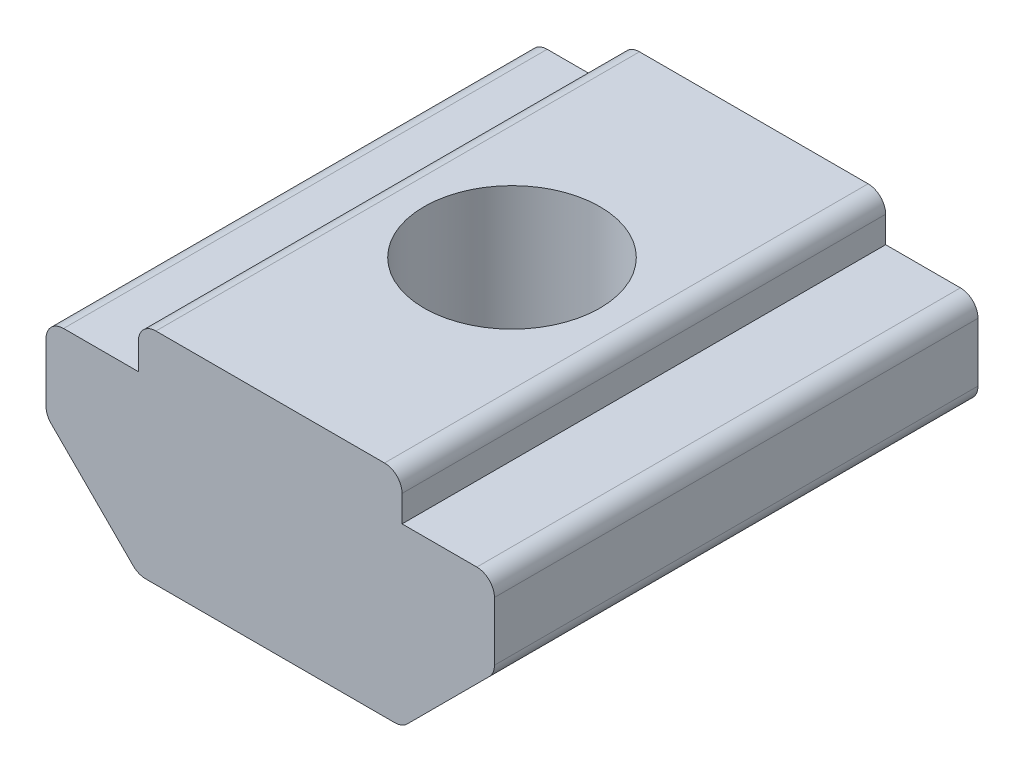
ISO-10303-21;
HEADER;
FILE_DESCRIPTION(('STEP AP214'),'2;1');
FILE_NAME('part.step','',(''),(''),'','','');
FILE_SCHEMA(('AUTOMOTIVE_DESIGN { 1 0 10303 214 1 1 1 1 }'));
ENDSEC;
DATA;
#1=APPLICATION_CONTEXT('core data for automotive mechanical design processes');
#2=APPLICATION_PROTOCOL_DEFINITION('international standard','automotive_design',2000,#1);
#3=PRODUCT_CONTEXT('',#1,'mechanical');
#4=PRODUCT('Part','Part','',(#3));
#5=PRODUCT_RELATED_PRODUCT_CATEGORY('part','',(#4));
#6=PRODUCT_DEFINITION_FORMATION('','',#4);
#7=PRODUCT_DEFINITION_CONTEXT('part definition',#1,'design');
#8=PRODUCT_DEFINITION('design','',#6,#7);
#9=PRODUCT_DEFINITION_SHAPE('','',#8);
#10=(LENGTH_UNIT() NAMED_UNIT(*) SI_UNIT(.MILLI.,.METRE.));
#11=(NAMED_UNIT(*) PLANE_ANGLE_UNIT() SI_UNIT($,.RADIAN.));
#12=(NAMED_UNIT(*) SI_UNIT($,.STERADIAN.) SOLID_ANGLE_UNIT());
#13=UNCERTAINTY_MEASURE_WITH_UNIT(LENGTH_MEASURE(1.E-05),#10,'distance_accuracy_value','');
#14=(GEOMETRIC_REPRESENTATION_CONTEXT(3) GLOBAL_UNCERTAINTY_ASSIGNED_CONTEXT((#13)) GLOBAL_UNIT_ASSIGNED_CONTEXT((#10,
#11,#12)) REPRESENTATION_CONTEXT('',''));
#15=CARTESIAN_POINT('',(0.,0.,0.));
#16=DIRECTION('',(0.,0.,1.));
#17=DIRECTION('',(1.,0.,0.));
#18=AXIS2_PLACEMENT_3D('',#15,#16,#17);
#19=CARTESIAN_POINT('',(-5.1,-1.9,5.5));
#20=DIRECTION('',(1.,0.,0.));
#21=DIRECTION('',(0.,1.,0.));
#22=AXIS2_PLACEMENT_3D('',#19,#20,#21);
#23=PLANE('',#22);
#24=DIRECTION('',(0.,-1.,0.));
#25=VECTOR('',#24,1.);
#26=CARTESIAN_POINT('',(-5.1,-1.9,5.5));
#27=LINE('',#26,#25);
#28=CARTESIAN_POINT('',(-5.1,-0.4,5.5));
#29=VERTEX_POINT('',#28);
#30=CARTESIAN_POINT('',(-5.1,-1.73431457505077,5.5));
#31=VERTEX_POINT('',#30);
#32=EDGE_CURVE('E226',#29,#31,#27,.T.);
#33=ORIENTED_EDGE('',*,*,#32,.F.);
#34=DIRECTION('',(0.,0.,-1.));
#35=VECTOR('',#34,1.);
#36=CARTESIAN_POINT('',(-5.1,-0.4,5.5));
#37=LINE('',#36,#35);
#38=CARTESIAN_POINT('',(-5.1,-0.4,-5.5));
#39=VERTEX_POINT('',#38);
#40=EDGE_CURVE('E269',#29,#39,#37,.T.);
#41=ORIENTED_EDGE('',*,*,#40,.T.);
#42=DIRECTION('',(0.,-1.,0.));
#43=VECTOR('',#42,1.);
#44=CARTESIAN_POINT('',(-5.1,-1.9,-5.5));
#45=LINE('',#44,#43);
#46=CARTESIAN_POINT('',(-5.1,-1.73431457505077,-5.5));
#47=VERTEX_POINT('',#46);
#48=EDGE_CURVE('E200',#39,#47,#45,.T.);
#49=ORIENTED_EDGE('',*,*,#48,.T.);
#50=DIRECTION('',(0.,0.,-1.));
#51=VECTOR('',#50,1.);
#52=CARTESIAN_POINT('',(-5.1,-1.73431457505077,5.5));
#53=LINE('',#52,#51);
#54=EDGE_CURVE('E267',#47,#31,#53,.F.);
#55=ORIENTED_EDGE('',*,*,#54,.T.);
#56=EDGE_LOOP('',(#33,#41,#49,#55));
#57=FACE_BOUND('',#56,.T.);
#58=ADVANCED_FACE('F37',(#57),#23,.F.);
#59=CARTESIAN_POINT('',(-3.,-4.,5.5));
#60=DIRECTION('',(0.707106781186547,0.707106781186548,0.));
#61=DIRECTION('',(-0.707106781186548,0.707106781186547,0.));
#62=AXIS2_PLACEMENT_3D('',#59,#60,#61);
#63=PLANE('',#62);
#64=DIRECTION('',(0.707106781186548,-0.707106781186547,0.));
#65=VECTOR('',#64,1.);
#66=CARTESIAN_POINT('',(-3.,-4.,5.5));
#67=LINE('',#66,#65);
#68=CARTESIAN_POINT('',(-4.98284271247462,-2.01715728752538,5.5));
#69=VERTEX_POINT('',#68);
#70=CARTESIAN_POINT('',(-3.11715728752538,-3.88284271247462,5.5));
#71=VERTEX_POINT('',#70);
#72=EDGE_CURVE('E310',#69,#71,#67,.T.);
#73=ORIENTED_EDGE('',*,*,#72,.F.);
#74=DIRECTION('',(0.,0.,-1.));
#75=VECTOR('',#74,1.);
#76=CARTESIAN_POINT('',(-4.98284271247462,-2.01715728752538,5.5));
#77=LINE('',#76,#75);
#78=CARTESIAN_POINT('',(-4.98284271247462,-2.01715728752538,-5.5));
#79=VERTEX_POINT('',#78);
#80=EDGE_CURVE('E275',#69,#79,#77,.T.);
#81=ORIENTED_EDGE('',*,*,#80,.T.);
#82=DIRECTION('',(0.707106781186548,-0.707106781186547,0.));
#83=VECTOR('',#82,1.);
#84=CARTESIAN_POINT('',(-3.,-4.,-5.5));
#85=LINE('',#84,#83);
#86=CARTESIAN_POINT('',(-3.11715728752538,-3.88284271247462,-5.5));
#87=VERTEX_POINT('',#86);
#88=EDGE_CURVE('E203',#79,#87,#85,.T.);
#89=ORIENTED_EDGE('',*,*,#88,.T.);
#90=DIRECTION('',(0.,0.,-1.));
#91=VECTOR('',#90,1.);
#92=CARTESIAN_POINT('',(-3.11715728752538,-3.88284271247462,5.5));
#93=LINE('',#92,#91);
#94=EDGE_CURVE('E273',#87,#71,#93,.F.);
#95=ORIENTED_EDGE('',*,*,#94,.T.);
#96=EDGE_LOOP('',(#73,#81,#89,#95));
#97=FACE_BOUND('',#96,.T.);
#98=ADVANCED_FACE('F363',(#97),#63,.F.);
#99=CARTESIAN_POINT('',(3.,-4.,5.5));
#100=DIRECTION('',(0.,1.,0.));
#101=DIRECTION('',(0.,0.,1.));
#102=AXIS2_PLACEMENT_3D('',#99,#100,#101);
#103=PLANE('',#102);
#104=CARTESIAN_POINT('',(0.,-4.,0.));
#105=DIRECTION('',(0.,1.,0.));
#106=DIRECTION('',(0.,0.,1.));
#107=AXIS2_PLACEMENT_3D('',#104,#105,#106);
#108=CIRCLE('',#107,2.);
#109=CARTESIAN_POINT('',(0.,-4.,2.));
#110=VERTEX_POINT('',#109);
#111=EDGE_CURVE('E204',#110,#110,#108,.T.);
#112=ORIENTED_EDGE('',*,*,#111,.T.);
#113=EDGE_LOOP('',(#112));
#114=FACE_BOUND('',#113,.T.);
#115=DIRECTION('',(1.,0.,0.));
#116=VECTOR('',#115,1.);
#117=CARTESIAN_POINT('',(3.,-4.,5.5));
#118=LINE('',#117,#116);
#119=CARTESIAN_POINT('',(-2.83431457505076,-4.,5.5));
#120=VERTEX_POINT('',#119);
#121=CARTESIAN_POINT('',(2.83431457505076,-4.,5.5));
#122=VERTEX_POINT('',#121);
#123=EDGE_CURVE('E305',#120,#122,#118,.T.);
#124=ORIENTED_EDGE('',*,*,#123,.F.);
#125=DIRECTION('',(0.,0.,-1.));
#126=VECTOR('',#125,1.);
#127=CARTESIAN_POINT('',(-2.83431457505076,-4.,5.5));
#128=LINE('',#127,#126);
#129=CARTESIAN_POINT('',(-2.83431457505076,-4.,-5.5));
#130=VERTEX_POINT('',#129);
#131=EDGE_CURVE('E280',#120,#130,#128,.T.);
#132=ORIENTED_EDGE('',*,*,#131,.T.);
#133=DIRECTION('',(1.,0.,0.));
#134=VECTOR('',#133,1.);
#135=CARTESIAN_POINT('',(3.,-4.,-5.5));
#136=LINE('',#135,#134);
#137=CARTESIAN_POINT('',(2.83431457505076,-4.,-5.5));
#138=VERTEX_POINT('',#137);
#139=EDGE_CURVE('E207',#130,#138,#136,.T.);
#140=ORIENTED_EDGE('',*,*,#139,.T.);
#141=DIRECTION('',(0.,0.,-1.));
#142=VECTOR('',#141,1.);
#143=CARTESIAN_POINT('',(2.83431457505076,-4.,5.5));
#144=LINE('',#143,#142);
#145=EDGE_CURVE('E278',#138,#122,#144,.F.);
#146=ORIENTED_EDGE('',*,*,#145,.T.);
#147=EDGE_LOOP('',(#124,#132,#140,#146));
#148=FACE_BOUND('',#147,.T.);
#149=ADVANCED_FACE('F321',(#114,#148),#103,.F.);
#150=CARTESIAN_POINT('',(5.1,-1.9,5.5));
#151=DIRECTION('',(-0.707106781186547,0.707106781186548,0.));
#152=DIRECTION('',(-0.707106781186548,-0.707106781186547,0.));
#153=AXIS2_PLACEMENT_3D('',#150,#151,#152);
#154=PLANE('',#153);
#155=DIRECTION('',(0.707106781186548,0.707106781186547,0.));
#156=VECTOR('',#155,1.);
#157=CARTESIAN_POINT('',(5.1,-1.9,5.5));
#158=LINE('',#157,#156);
#159=CARTESIAN_POINT('',(3.11715728752538,-3.88284271247462,5.5));
#160=VERTEX_POINT('',#159);
#161=CARTESIAN_POINT('',(4.98284271247462,-2.01715728752538,5.5));
#162=VERTEX_POINT('',#161);
#163=EDGE_CURVE('E304',#160,#162,#158,.T.);
#164=ORIENTED_EDGE('',*,*,#163,.F.);
#165=DIRECTION('',(0.,0.,-1.));
#166=VECTOR('',#165,1.);
#167=CARTESIAN_POINT('',(3.11715728752538,-3.88284271247462,5.5));
#168=LINE('',#167,#166);
#169=CARTESIAN_POINT('',(3.11715728752538,-3.88284271247462,-5.5));
#170=VERTEX_POINT('',#169);
#171=EDGE_CURVE('E285',#160,#170,#168,.T.);
#172=ORIENTED_EDGE('',*,*,#171,.T.);
#173=DIRECTION('',(0.707106781186548,0.707106781186547,0.));
#174=VECTOR('',#173,1.);
#175=CARTESIAN_POINT('',(5.1,-1.9,-5.5));
#176=LINE('',#175,#174);
#177=CARTESIAN_POINT('',(4.98284271247462,-2.01715728752538,-5.5));
#178=VERTEX_POINT('',#177);
#179=EDGE_CURVE('E210',#170,#178,#176,.T.);
#180=ORIENTED_EDGE('',*,*,#179,.T.);
#181=DIRECTION('',(0.,0.,-1.));
#182=VECTOR('',#181,1.);
#183=CARTESIAN_POINT('',(4.98284271247462,-2.01715728752538,5.5));
#184=LINE('',#183,#182);
#185=EDGE_CURVE('E283',#178,#162,#184,.F.);
#186=ORIENTED_EDGE('',*,*,#185,.T.);
#187=EDGE_LOOP('',(#164,#172,#180,#186));
#188=FACE_BOUND('',#187,.T.);
#189=ADVANCED_FACE('F378',(#188),#154,.F.);
#190=CARTESIAN_POINT('',(5.1,0.,5.5));
#191=DIRECTION('',(-1.,0.,0.));
#192=DIRECTION('',(0.,-1.,0.));
#193=AXIS2_PLACEMENT_3D('',#190,#191,#192);
#194=PLANE('',#193);
#195=DIRECTION('',(0.,1.,0.));
#196=VECTOR('',#195,1.);
#197=CARTESIAN_POINT('',(5.1,0.,5.5));
#198=LINE('',#197,#196);
#199=CARTESIAN_POINT('',(5.1,-1.73431457505076,5.5));
#200=VERTEX_POINT('',#199);
#201=CARTESIAN_POINT('',(5.1,-0.4,5.5));
#202=VERTEX_POINT('',#201);
#203=EDGE_CURVE('E175',#200,#202,#198,.T.);
#204=ORIENTED_EDGE('',*,*,#203,.F.);
#205=DIRECTION('',(0.,0.,-1.));
#206=VECTOR('',#205,1.);
#207=CARTESIAN_POINT('',(5.1,-1.73431457505076,5.5));
#208=LINE('',#207,#206);
#209=CARTESIAN_POINT('',(5.1,-1.73431457505076,-5.5));
#210=VERTEX_POINT('',#209);
#211=EDGE_CURVE('E45',#200,#210,#208,.T.);
#212=ORIENTED_EDGE('',*,*,#211,.T.);
#213=DIRECTION('',(0.,1.,0.));
#214=VECTOR('',#213,1.);
#215=CARTESIAN_POINT('',(5.1,0.,-5.5));
#216=LINE('',#215,#214);
#217=CARTESIAN_POINT('',(5.1,-0.4,-5.5));
#218=VERTEX_POINT('',#217);
#219=EDGE_CURVE('E213',#210,#218,#216,.T.);
#220=ORIENTED_EDGE('',*,*,#219,.T.);
#221=DIRECTION('',(0.,0.,-1.));
#222=VECTOR('',#221,1.);
#223=CARTESIAN_POINT('',(5.1,-0.4,5.5));
#224=LINE('',#223,#222);
#225=EDGE_CURVE('E288',#218,#202,#224,.F.);
#226=ORIENTED_EDGE('',*,*,#225,.T.);
#227=EDGE_LOOP('',(#204,#212,#220,#226));
#228=FACE_BOUND('',#227,.T.);
#229=ADVANCED_FACE('F294',(#228),#194,.F.);
#230=CARTESIAN_POINT('',(3.,0.,5.5));
#231=DIRECTION('',(0.,-1.,0.));
#232=DIRECTION('',(0.,0.,-1.));
#233=AXIS2_PLACEMENT_3D('',#230,#231,#232);
#234=PLANE('',#233);
#235=DIRECTION('',(-1.,0.,0.));
#236=VECTOR('',#235,1.);
#237=CARTESIAN_POINT('',(3.,0.,5.5));
#238=LINE('',#237,#236);
#239=CARTESIAN_POINT('',(4.7,0.,5.5));
#240=VERTEX_POINT('',#239);
#241=CARTESIAN_POINT('',(3.,0.,5.5));
#242=VERTEX_POINT('',#241);
#243=EDGE_CURVE('E164',#240,#242,#238,.T.);
#244=ORIENTED_EDGE('',*,*,#243,.F.);
#245=DIRECTION('',(0.,0.,-1.));
#246=VECTOR('',#245,1.);
#247=CARTESIAN_POINT('',(4.7,0.,5.5));
#248=LINE('',#247,#246);
#249=CARTESIAN_POINT('',(4.7,0.,-5.5));
#250=VERTEX_POINT('',#249);
#251=EDGE_CURVE('E11',#240,#250,#248,.T.);
#252=ORIENTED_EDGE('',*,*,#251,.T.);
#253=DIRECTION('',(-1.,0.,0.));
#254=VECTOR('',#253,1.);
#255=CARTESIAN_POINT('',(3.,0.,-5.5));
#256=LINE('',#255,#254);
#257=CARTESIAN_POINT('',(3.,0.,-5.5));
#258=VERTEX_POINT('',#257);
#259=EDGE_CURVE('E181',#250,#258,#256,.T.);
#260=ORIENTED_EDGE('',*,*,#259,.T.);
#261=DIRECTION('',(0.,0.,-1.));
#262=VECTOR('',#261,1.);
#263=CARTESIAN_POINT('',(3.,0.,5.5));
#264=LINE('',#263,#262);
#265=EDGE_CURVE('E178',#242,#258,#264,.T.);
#266=ORIENTED_EDGE('',*,*,#265,.F.);
#267=EDGE_LOOP('',(#244,#252,#260,#266));
#268=FACE_BOUND('',#267,.T.);
#269=ADVANCED_FACE('F179',(#268),#234,.F.);
#270=CARTESIAN_POINT('',(3.,0.999999999999999,5.5));
#271=DIRECTION('',(-1.,0.,0.));
#272=DIRECTION('',(0.,0.,1.));
#273=AXIS2_PLACEMENT_3D('',#270,#271,#272);
#274=PLANE('',#273);
#275=DIRECTION('',(0.,1.,0.));
#276=VECTOR('',#275,1.);
#277=CARTESIAN_POINT('',(3.,0.999999999999999,-5.5));
#278=LINE('',#277,#276);
#279=CARTESIAN_POINT('',(3.,0.599999999999999,-5.5));
#280=VERTEX_POINT('',#279);
#281=EDGE_CURVE('E217',#258,#280,#278,.T.);
#282=ORIENTED_EDGE('',*,*,#281,.T.);
#283=DIRECTION('',(0.,0.,-1.));
#284=VECTOR('',#283,1.);
#285=CARTESIAN_POINT('',(3.,0.599999999999999,5.5));
#286=LINE('',#285,#284);
#287=CARTESIAN_POINT('',(3.,0.599999999999999,5.5));
#288=VERTEX_POINT('',#287);
#289=EDGE_CURVE('E190',#280,#288,#286,.F.);
#290=ORIENTED_EDGE('',*,*,#289,.T.);
#291=DIRECTION('',(0.,1.,0.));
#292=VECTOR('',#291,1.);
#293=CARTESIAN_POINT('',(3.,0.999999999999999,5.5));
#294=LINE('',#293,#292);
#295=EDGE_CURVE('E168',#242,#288,#294,.T.);
#296=ORIENTED_EDGE('',*,*,#295,.F.);
#297=ORIENTED_EDGE('',*,*,#265,.T.);
#298=EDGE_LOOP('',(#282,#290,#296,#297));
#299=FACE_BOUND('',#298,.T.);
#300=ADVANCED_FACE('F188',(#299),#274,.F.);
#301=CARTESIAN_POINT('',(-3.,0.999999999999999,5.5));
#302=DIRECTION('',(0.,-1.,0.));
#303=DIRECTION('',(0.,0.,-1.));
#304=AXIS2_PLACEMENT_3D('',#301,#302,#303);
#305=PLANE('',#304);
#306=CARTESIAN_POINT('',(0.,0.999999999999999,0.));
#307=DIRECTION('',(0.,1.,0.));
#308=DIRECTION('',(0.,0.,1.));
#309=AXIS2_PLACEMENT_3D('',#306,#307,#308);
#310=CIRCLE('',#309,2.);
#311=CARTESIAN_POINT('',(0.,0.999999999999999,2.));
#312=VERTEX_POINT('',#311);
#313=EDGE_CURVE('E315',#312,#312,#310,.T.);
#314=ORIENTED_EDGE('',*,*,#313,.F.);
#315=EDGE_LOOP('',(#314));
#316=FACE_BOUND('',#315,.T.);
#317=DIRECTION('',(-1.,0.,0.));
#318=VECTOR('',#317,1.);
#319=CARTESIAN_POINT('',(-3.,0.999999999999999,5.5));
#320=LINE('',#319,#318);
#321=CARTESIAN_POINT('',(2.6,0.999999999999999,5.5));
#322=VERTEX_POINT('',#321);
#323=CARTESIAN_POINT('',(-2.6,0.999999999999999,5.5));
#324=VERTEX_POINT('',#323);
#325=EDGE_CURVE('E191',#322,#324,#320,.T.);
#326=ORIENTED_EDGE('',*,*,#325,.F.);
#327=DIRECTION('',(0.,0.,-1.));
#328=VECTOR('',#327,1.);
#329=CARTESIAN_POINT('',(2.6,0.999999999999999,5.5));
#330=LINE('',#329,#328);
#331=CARTESIAN_POINT('',(2.6,0.999999999999999,-5.5));
#332=VERTEX_POINT('',#331);
#333=EDGE_CURVE('E230',#322,#332,#330,.T.);
#334=ORIENTED_EDGE('',*,*,#333,.T.);
#335=DIRECTION('',(-1.,0.,0.));
#336=VECTOR('',#335,1.);
#337=CARTESIAN_POINT('',(-3.,0.999999999999999,-5.5));
#338=LINE('',#337,#336);
#339=CARTESIAN_POINT('',(-2.6,0.999999999999999,-5.5));
#340=VERTEX_POINT('',#339);
#341=EDGE_CURVE('E219',#332,#340,#338,.T.);
#342=ORIENTED_EDGE('',*,*,#341,.T.);
#343=DIRECTION('',(0.,0.,-1.));
#344=VECTOR('',#343,1.);
#345=CARTESIAN_POINT('',(-2.6,0.999999999999999,5.5));
#346=LINE('',#345,#344);
#347=EDGE_CURVE('E185',#340,#324,#346,.F.);
#348=ORIENTED_EDGE('',*,*,#347,.T.);
#349=EDGE_LOOP('',(#326,#334,#342,#348));
#350=FACE_BOUND('',#349,.T.);
#351=ADVANCED_FACE('F331',(#316,#350),#305,.F.);
#352=CARTESIAN_POINT('',(-3.,0.,5.5));
#353=DIRECTION('',(1.,0.,0.));
#354=DIRECTION('',(0.,0.,-1.));
#355=AXIS2_PLACEMENT_3D('',#352,#353,#354);
#356=PLANE('',#355);
#357=DIRECTION('',(0.,-1.,0.));
#358=VECTOR('',#357,1.);
#359=CARTESIAN_POINT('',(-3.,0.,5.5));
#360=LINE('',#359,#358);
#361=CARTESIAN_POINT('',(-3.,0.599999999999999,5.5));
#362=VERTEX_POINT('',#361);
#363=CARTESIAN_POINT('',(-3.,0.,5.5));
#364=VERTEX_POINT('',#363);
#365=EDGE_CURVE('E193',#362,#364,#360,.T.);
#366=ORIENTED_EDGE('',*,*,#365,.F.);
#367=DIRECTION('',(0.,0.,-1.));
#368=VECTOR('',#367,1.);
#369=CARTESIAN_POINT('',(-3.,0.599999999999999,5.5));
#370=LINE('',#369,#368);
#371=CARTESIAN_POINT('',(-3.,0.599999999999999,-5.5));
#372=VERTEX_POINT('',#371);
#373=EDGE_CURVE('E264',#362,#372,#370,.T.);
#374=ORIENTED_EDGE('',*,*,#373,.T.);
#375=DIRECTION('',(0.,-1.,0.));
#376=VECTOR('',#375,1.);
#377=CARTESIAN_POINT('',(-3.,0.,-5.5));
#378=LINE('',#377,#376);
#379=CARTESIAN_POINT('',(-3.,0.,-5.5));
#380=VERTEX_POINT('',#379);
#381=EDGE_CURVE('E222',#372,#380,#378,.T.);
#382=ORIENTED_EDGE('',*,*,#381,.T.);
#383=DIRECTION('',(0.,0.,-1.));
#384=VECTOR('',#383,1.);
#385=CARTESIAN_POINT('',(-3.,0.,5.5));
#386=LINE('',#385,#384);
#387=EDGE_CURVE('E186',#364,#380,#386,.T.);
#388=ORIENTED_EDGE('',*,*,#387,.F.);
#389=EDGE_LOOP('',(#366,#374,#382,#388));
#390=FACE_BOUND('',#389,.T.);
#391=ADVANCED_FACE('F334',(#390),#356,.F.);
#392=CARTESIAN_POINT('',(-5.1,0.,5.5));
#393=DIRECTION('',(0.,-1.,0.));
#394=DIRECTION('',(0.,0.,-1.));
#395=AXIS2_PLACEMENT_3D('',#392,#393,#394);
#396=PLANE('',#395);
#397=DIRECTION('',(-1.,0.,0.));
#398=VECTOR('',#397,1.);
#399=CARTESIAN_POINT('',(-5.1,0.,-5.5));
#400=LINE('',#399,#398);
#401=CARTESIAN_POINT('',(-4.7,0.,-5.5));
#402=VERTEX_POINT('',#401);
#403=EDGE_CURVE('E224',#380,#402,#400,.T.);
#404=ORIENTED_EDGE('',*,*,#403,.T.);
#405=DIRECTION('',(0.,0.,-1.));
#406=VECTOR('',#405,1.);
#407=CARTESIAN_POINT('',(-4.7,0.,5.5));
#408=LINE('',#407,#406);
#409=CARTESIAN_POINT('',(-4.7,0.,5.5));
#410=VERTEX_POINT('',#409);
#411=EDGE_CURVE('E52',#402,#410,#408,.F.);
#412=ORIENTED_EDGE('',*,*,#411,.T.);
#413=DIRECTION('',(-1.,0.,0.));
#414=VECTOR('',#413,1.);
#415=CARTESIAN_POINT('',(-5.1,0.,5.5));
#416=LINE('',#415,#414);
#417=EDGE_CURVE('E198',#364,#410,#416,.T.);
#418=ORIENTED_EDGE('',*,*,#417,.F.);
#419=ORIENTED_EDGE('',*,*,#387,.T.);
#420=EDGE_LOOP('',(#404,#412,#418,#419));
#421=FACE_BOUND('',#420,.T.);
#422=ADVANCED_FACE('F348',(#421),#396,.F.);
#423=CARTESIAN_POINT('',(0.,0.,5.5));
#424=DIRECTION('',(0.,0.,-1.));
#425=DIRECTION('',(-1.,0.,0.));
#426=AXIS2_PLACEMENT_3D('',#423,#424,#425);
#427=PLANE('',#426);
#428=ORIENTED_EDGE('',*,*,#295,.T.);
#429=CARTESIAN_POINT('',(2.6,0.599999999999999,5.5));
#430=DIRECTION('',(0.,0.,-1.));
#431=DIRECTION('',(-1.,0.,0.));
#432=AXIS2_PLACEMENT_3D('',#429,#430,#431);
#433=CIRCLE('',#432,0.4);
#434=EDGE_CURVE('E262',#288,#322,#433,.F.);
#435=ORIENTED_EDGE('',*,*,#434,.T.);
#436=ORIENTED_EDGE('',*,*,#325,.T.);
#437=CARTESIAN_POINT('',(-2.6,0.599999999999999,5.5));
#438=DIRECTION('',(0.,0.,-1.));
#439=DIRECTION('',(-1.,0.,0.));
#440=AXIS2_PLACEMENT_3D('',#437,#438,#439);
#441=CIRCLE('',#440,0.4);
#442=EDGE_CURVE('E60',#324,#362,#441,.F.);
#443=ORIENTED_EDGE('',*,*,#442,.T.);
#444=ORIENTED_EDGE('',*,*,#365,.T.);
#445=ORIENTED_EDGE('',*,*,#417,.T.);
#446=CARTESIAN_POINT('',(-4.7,-0.4,5.5));
#447=DIRECTION('',(0.,0.,-1.));
#448=DIRECTION('',(-1.,0.,0.));
#449=AXIS2_PLACEMENT_3D('',#446,#447,#448);
#450=CIRCLE('',#449,0.4);
#451=EDGE_CURVE('E259',#410,#29,#450,.F.);
#452=ORIENTED_EDGE('',*,*,#451,.T.);
#453=ORIENTED_EDGE('',*,*,#32,.T.);
#454=CARTESIAN_POINT('',(-4.7,-1.73431457505077,5.5));
#455=DIRECTION('',(0.,0.,-1.));
#456=DIRECTION('',(-1.,0.,0.));
#457=AXIS2_PLACEMENT_3D('',#454,#455,#456);
#458=CIRCLE('',#457,0.4);
#459=EDGE_CURVE('E257',#31,#69,#458,.F.);
#460=ORIENTED_EDGE('',*,*,#459,.T.);
#461=ORIENTED_EDGE('',*,*,#72,.T.);
#462=CARTESIAN_POINT('',(-2.83431457505076,-3.6,5.5));
#463=DIRECTION('',(0.,0.,-1.));
#464=DIRECTION('',(-1.,0.,0.));
#465=AXIS2_PLACEMENT_3D('',#462,#463,#464);
#466=CIRCLE('',#465,0.4);
#467=EDGE_CURVE('E255',#71,#120,#466,.F.);
#468=ORIENTED_EDGE('',*,*,#467,.T.);
#469=ORIENTED_EDGE('',*,*,#123,.T.);
#470=CARTESIAN_POINT('',(2.83431457505076,-3.6,5.5));
#471=DIRECTION('',(0.,0.,-1.));
#472=DIRECTION('',(-1.,0.,0.));
#473=AXIS2_PLACEMENT_3D('',#470,#471,#472);
#474=CIRCLE('',#473,0.4);
#475=EDGE_CURVE('E253',#122,#160,#474,.F.);
#476=ORIENTED_EDGE('',*,*,#475,.T.);
#477=ORIENTED_EDGE('',*,*,#163,.T.);
#478=CARTESIAN_POINT('',(4.7,-1.73431457505076,5.5));
#479=DIRECTION('',(0.,0.,-1.));
#480=DIRECTION('',(-1.,0.,0.));
#481=AXIS2_PLACEMENT_3D('',#478,#479,#480);
#482=CIRCLE('',#481,0.4);
#483=EDGE_CURVE('E251',#162,#200,#482,.F.);
#484=ORIENTED_EDGE('',*,*,#483,.T.);
#485=ORIENTED_EDGE('',*,*,#203,.T.);
#486=CARTESIAN_POINT('',(4.7,-0.4,5.5));
#487=DIRECTION('',(0.,0.,-1.));
#488=DIRECTION('',(-1.,0.,0.));
#489=AXIS2_PLACEMENT_3D('',#486,#487,#488);
#490=CIRCLE('',#489,0.4);
#491=EDGE_CURVE('E172',#202,#240,#490,.F.);
#492=ORIENTED_EDGE('',*,*,#491,.T.);
#493=ORIENTED_EDGE('',*,*,#243,.T.);
#494=EDGE_LOOP('',(#428,#435,#436,#443,#444,#445,#452,#453,#460,#461,#468,#469,#476,#477,#484,
#485,#492,#493));
#495=FACE_BOUND('',#494,.T.);
#496=ADVANCED_FACE('F166',(#495),#427,.F.);
#497=CARTESIAN_POINT('',(0.,0.,-5.5));
#498=DIRECTION('',(0.,0.,-1.));
#499=DIRECTION('',(-1.,0.,0.));
#500=AXIS2_PLACEMENT_3D('',#497,#498,#499);
#501=PLANE('',#500);
#502=ORIENTED_EDGE('',*,*,#341,.F.);
#503=CARTESIAN_POINT('',(2.6,0.599999999999999,-5.5));
#504=DIRECTION('',(0.,0.,-1.));
#505=DIRECTION('',(-1.,0.,0.));
#506=AXIS2_PLACEMENT_3D('',#503,#504,#505);
#507=CIRCLE('',#506,0.4);
#508=EDGE_CURVE('E247',#332,#280,#507,.T.);
#509=ORIENTED_EDGE('',*,*,#508,.T.);
#510=ORIENTED_EDGE('',*,*,#281,.F.);
#511=ORIENTED_EDGE('',*,*,#259,.F.);
#512=CARTESIAN_POINT('',(4.7,-0.4,-5.5));
#513=DIRECTION('',(0.,0.,-1.));
#514=DIRECTION('',(-1.,0.,0.));
#515=AXIS2_PLACEMENT_3D('',#512,#513,#514);
#516=CIRCLE('',#515,0.4);
#517=EDGE_CURVE('E233',#250,#218,#516,.T.);
#518=ORIENTED_EDGE('',*,*,#517,.T.);
#519=ORIENTED_EDGE('',*,*,#219,.F.);
#520=CARTESIAN_POINT('',(4.7,-1.73431457505076,-5.5));
#521=DIRECTION('',(0.,0.,-1.));
#522=DIRECTION('',(-1.,0.,0.));
#523=AXIS2_PLACEMENT_3D('',#520,#521,#522);
#524=CIRCLE('',#523,0.4);
#525=EDGE_CURVE('E235',#210,#178,#524,.T.);
#526=ORIENTED_EDGE('',*,*,#525,.T.);
#527=ORIENTED_EDGE('',*,*,#179,.F.);
#528=CARTESIAN_POINT('',(2.83431457505076,-3.6,-5.5));
#529=DIRECTION('',(0.,0.,-1.));
#530=DIRECTION('',(-1.,0.,0.));
#531=AXIS2_PLACEMENT_3D('',#528,#529,#530);
#532=CIRCLE('',#531,0.4);
#533=EDGE_CURVE('E237',#170,#138,#532,.T.);
#534=ORIENTED_EDGE('',*,*,#533,.T.);
#535=ORIENTED_EDGE('',*,*,#139,.F.);
#536=CARTESIAN_POINT('',(-2.83431457505076,-3.6,-5.5));
#537=DIRECTION('',(0.,0.,-1.));
#538=DIRECTION('',(-1.,0.,0.));
#539=AXIS2_PLACEMENT_3D('',#536,#537,#538);
#540=CIRCLE('',#539,0.4);
#541=EDGE_CURVE('E239',#130,#87,#540,.T.);
#542=ORIENTED_EDGE('',*,*,#541,.T.);
#543=ORIENTED_EDGE('',*,*,#88,.F.);
#544=CARTESIAN_POINT('',(-4.7,-1.73431457505077,-5.5));
#545=DIRECTION('',(0.,0.,-1.));
#546=DIRECTION('',(-1.,0.,0.));
#547=AXIS2_PLACEMENT_3D('',#544,#545,#546);
#548=CIRCLE('',#547,0.4);
#549=EDGE_CURVE('E241',#79,#47,#548,.T.);
#550=ORIENTED_EDGE('',*,*,#549,.T.);
#551=ORIENTED_EDGE('',*,*,#48,.F.);
#552=CARTESIAN_POINT('',(-4.7,-0.4,-5.5));
#553=DIRECTION('',(0.,0.,-1.));
#554=DIRECTION('',(-1.,0.,0.));
#555=AXIS2_PLACEMENT_3D('',#552,#553,#554);
#556=CIRCLE('',#555,0.4);
#557=EDGE_CURVE('E243',#39,#402,#556,.T.);
#558=ORIENTED_EDGE('',*,*,#557,.T.);
#559=ORIENTED_EDGE('',*,*,#403,.F.);
#560=ORIENTED_EDGE('',*,*,#381,.F.);
#561=CARTESIAN_POINT('',(-2.6,0.599999999999999,-5.5));
#562=DIRECTION('',(0.,0.,-1.));
#563=DIRECTION('',(-1.,0.,0.));
#564=AXIS2_PLACEMENT_3D('',#561,#562,#563);
#565=CIRCLE('',#564,0.4);
#566=EDGE_CURVE('E245',#372,#340,#565,.T.);
#567=ORIENTED_EDGE('',*,*,#566,.T.);
#568=EDGE_LOOP('',(#502,#509,#510,#511,#518,#519,#526,#527,#534,#535,#542,#543,#550,#551,#558,
#559,#560,#567));
#569=FACE_BOUND('',#568,.T.);
#570=ADVANCED_FACE('F300',(#569),#501,.T.);
#571=CARTESIAN_POINT('',(0.,-4.,0.));
#572=DIRECTION('',(0.,1.,0.));
#573=DIRECTION('',(0.,0.,1.));
#574=AXIS2_PLACEMENT_3D('',#571,#572,#573);
#575=CYLINDRICAL_SURFACE('',#574,2.);
#576=ORIENTED_EDGE('',*,*,#111,.F.);
#577=EDGE_LOOP('',(#576));
#578=FACE_BOUND('',#577,.T.);
#579=ORIENTED_EDGE('',*,*,#313,.T.);
#580=EDGE_LOOP('',(#579));
#581=FACE_BOUND('',#580,.T.);
#582=ADVANCED_FACE('F324',(#578,#581),#575,.F.);
#583=CARTESIAN_POINT('',(2.6,0.599999999999999,5.5));
#584=DIRECTION('',(0.,0.,-1.));
#585=DIRECTION('',(-1.,0.,0.));
#586=AXIS2_PLACEMENT_3D('',#583,#584,#585);
#587=CYLINDRICAL_SURFACE('',#586,0.4);
#588=ORIENTED_EDGE('',*,*,#434,.F.);
#589=ORIENTED_EDGE('',*,*,#289,.F.);
#590=ORIENTED_EDGE('',*,*,#508,.F.);
#591=ORIENTED_EDGE('',*,*,#333,.F.);
#592=EDGE_LOOP('',(#588,#589,#590,#591));
#593=FACE_BOUND('',#592,.T.);
#594=ADVANCED_FACE('F327',(#593),#587,.T.);
#595=CARTESIAN_POINT('',(-2.6,0.599999999999999,5.5));
#596=DIRECTION('',(0.,0.,-1.));
#597=DIRECTION('',(-1.,0.,0.));
#598=AXIS2_PLACEMENT_3D('',#595,#596,#597);
#599=CYLINDRICAL_SURFACE('',#598,0.4);
#600=ORIENTED_EDGE('',*,*,#442,.F.);
#601=ORIENTED_EDGE('',*,*,#347,.F.);
#602=ORIENTED_EDGE('',*,*,#566,.F.);
#603=ORIENTED_EDGE('',*,*,#373,.F.);
#604=EDGE_LOOP('',(#600,#601,#602,#603));
#605=FACE_BOUND('',#604,.T.);
#606=ADVANCED_FACE('F342',(#605),#599,.T.);
#607=CARTESIAN_POINT('',(-4.7,-0.4,5.5));
#608=DIRECTION('',(0.,0.,-1.));
#609=DIRECTION('',(-1.,0.,0.));
#610=AXIS2_PLACEMENT_3D('',#607,#608,#609);
#611=CYLINDRICAL_SURFACE('',#610,0.4);
#612=ORIENTED_EDGE('',*,*,#451,.F.);
#613=ORIENTED_EDGE('',*,*,#411,.F.);
#614=ORIENTED_EDGE('',*,*,#557,.F.);
#615=ORIENTED_EDGE('',*,*,#40,.F.);
#616=EDGE_LOOP('',(#612,#613,#614,#615));
#617=FACE_BOUND('',#616,.T.);
#618=ADVANCED_FACE('F351',(#617),#611,.T.);
#619=CARTESIAN_POINT('',(-4.7,-1.73431457505077,5.5));
#620=DIRECTION('',(0.,0.,-1.));
#621=DIRECTION('',(-1.,0.,0.));
#622=AXIS2_PLACEMENT_3D('',#619,#620,#621);
#623=CYLINDRICAL_SURFACE('',#622,0.4);
#624=ORIENTED_EDGE('',*,*,#459,.F.);
#625=ORIENTED_EDGE('',*,*,#54,.F.);
#626=ORIENTED_EDGE('',*,*,#549,.F.);
#627=ORIENTED_EDGE('',*,*,#80,.F.);
#628=EDGE_LOOP('',(#624,#625,#626,#627));
#629=FACE_BOUND('',#628,.T.);
#630=ADVANCED_FACE('F358',(#629),#623,.T.);
#631=CARTESIAN_POINT('',(-2.83431457505076,-3.6,5.5));
#632=DIRECTION('',(0.,0.,-1.));
#633=DIRECTION('',(-1.,0.,0.));
#634=AXIS2_PLACEMENT_3D('',#631,#632,#633);
#635=CYLINDRICAL_SURFACE('',#634,0.4);
#636=ORIENTED_EDGE('',*,*,#467,.F.);
#637=ORIENTED_EDGE('',*,*,#94,.F.);
#638=ORIENTED_EDGE('',*,*,#541,.F.);
#639=ORIENTED_EDGE('',*,*,#131,.F.);
#640=EDGE_LOOP('',(#636,#637,#638,#639));
#641=FACE_BOUND('',#640,.T.);
#642=ADVANCED_FACE('F367',(#641),#635,.T.);
#643=CARTESIAN_POINT('',(2.83431457505076,-3.6,5.5));
#644=DIRECTION('',(0.,0.,-1.));
#645=DIRECTION('',(-1.,0.,0.));
#646=AXIS2_PLACEMENT_3D('',#643,#644,#645);
#647=CYLINDRICAL_SURFACE('',#646,0.4);
#648=ORIENTED_EDGE('',*,*,#475,.F.);
#649=ORIENTED_EDGE('',*,*,#145,.F.);
#650=ORIENTED_EDGE('',*,*,#533,.F.);
#651=ORIENTED_EDGE('',*,*,#171,.F.);
#652=EDGE_LOOP('',(#648,#649,#650,#651));
#653=FACE_BOUND('',#652,.T.);
#654=ADVANCED_FACE('F374',(#653),#647,.T.);
#655=CARTESIAN_POINT('',(4.7,-1.73431457505076,5.5));
#656=DIRECTION('',(0.,0.,-1.));
#657=DIRECTION('',(-1.,0.,0.));
#658=AXIS2_PLACEMENT_3D('',#655,#656,#657);
#659=CYLINDRICAL_SURFACE('',#658,0.4);
#660=ORIENTED_EDGE('',*,*,#483,.F.);
#661=ORIENTED_EDGE('',*,*,#185,.F.);
#662=ORIENTED_EDGE('',*,*,#525,.F.);
#663=ORIENTED_EDGE('',*,*,#211,.F.);
#664=EDGE_LOOP('',(#660,#661,#662,#663));
#665=FACE_BOUND('',#664,.T.);
#666=ADVANCED_FACE('F380',(#665),#659,.T.);
#667=CARTESIAN_POINT('',(4.7,-0.4,5.5));
#668=DIRECTION('',(0.,0.,-1.));
#669=DIRECTION('',(-1.,0.,0.));
#670=AXIS2_PLACEMENT_3D('',#667,#668,#669);
#671=CYLINDRICAL_SURFACE('',#670,0.4);
#672=ORIENTED_EDGE('',*,*,#491,.F.);
#673=ORIENTED_EDGE('',*,*,#225,.F.);
#674=ORIENTED_EDGE('',*,*,#517,.F.);
#675=ORIENTED_EDGE('',*,*,#251,.F.);
#676=EDGE_LOOP('',(#672,#673,#674,#675));
#677=FACE_BOUND('',#676,.T.);
#678=ADVANCED_FACE('F39',(#677),#671,.T.);
#679=CLOSED_SHELL('',(#58,#98,#149,#189,#229,#269,#300,#351,#391,#422,#496,#570,#582,#594,#606,
#618,#630,#642,#654,#666,#678));
#680=MANIFOLD_SOLID_BREP('B2',#679);
#681=ADVANCED_BREP_SHAPE_REPRESENTATION('',(#18,#680),#14);
#682=SHAPE_DEFINITION_REPRESENTATION(#9,#681);
ENDSEC;
END-ISO-10303-21;
